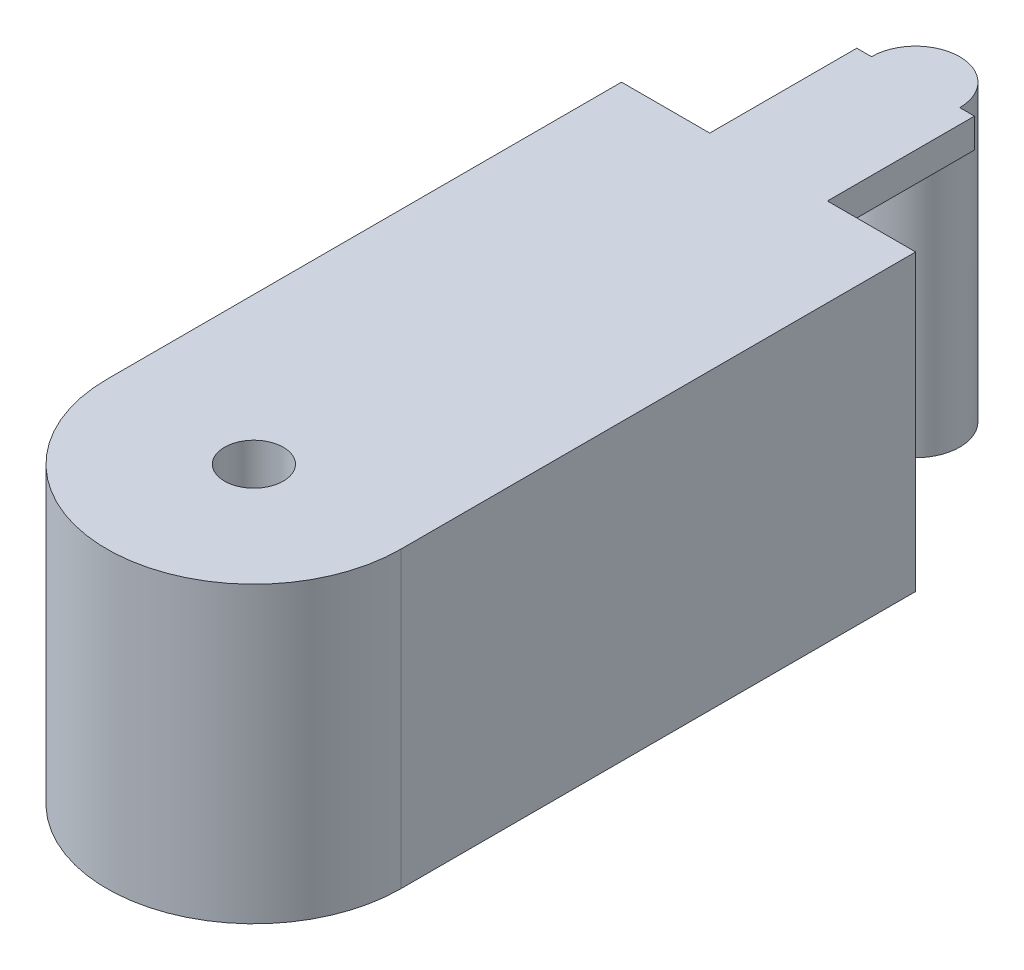
ISO-10303-21;
HEADER;
FILE_DESCRIPTION(('STEP AP214'),'2;1');
FILE_NAME('part.step','',(''),(''),'','','');
FILE_SCHEMA(('AUTOMOTIVE_DESIGN { 1 0 10303 214 1 1 1 1 }'));
ENDSEC;
DATA;
#1=APPLICATION_CONTEXT('core data for automotive mechanical design processes');
#2=APPLICATION_PROTOCOL_DEFINITION('international standard','automotive_design',2000,#1);
#3=PRODUCT_CONTEXT('',#1,'mechanical');
#4=PRODUCT('Part','Part','',(#3));
#5=PRODUCT_RELATED_PRODUCT_CATEGORY('part','',(#4));
#6=PRODUCT_DEFINITION_FORMATION('','',#4);
#7=PRODUCT_DEFINITION_CONTEXT('part definition',#1,'design');
#8=PRODUCT_DEFINITION('design','',#6,#7);
#9=PRODUCT_DEFINITION_SHAPE('','',#8);
#10=(LENGTH_UNIT() NAMED_UNIT(*) SI_UNIT(.MILLI.,.METRE.));
#11=(NAMED_UNIT(*) PLANE_ANGLE_UNIT() SI_UNIT($,.RADIAN.));
#12=(NAMED_UNIT(*) SI_UNIT($,.STERADIAN.) SOLID_ANGLE_UNIT());
#13=UNCERTAINTY_MEASURE_WITH_UNIT(LENGTH_MEASURE(1.E-05),#10,'distance_accuracy_value','');
#14=(GEOMETRIC_REPRESENTATION_CONTEXT(3) GLOBAL_UNCERTAINTY_ASSIGNED_CONTEXT((#13)) GLOBAL_UNIT_ASSIGNED_CONTEXT((#10,
#11,#12)) REPRESENTATION_CONTEXT('',''));
#15=CARTESIAN_POINT('',(0.,0.,0.));
#16=DIRECTION('',(0.,0.,1.));
#17=DIRECTION('',(1.,0.,0.));
#18=AXIS2_PLACEMENT_3D('',#15,#16,#17);
#19=CARTESIAN_POINT('',(0.,100.,0.));
#20=DIRECTION('',(0.,1.,0.));
#21=DIRECTION('',(0.,0.,1.));
#22=AXIS2_PLACEMENT_3D('',#19,#20,#21);
#23=PLANE('',#22);
#24=CARTESIAN_POINT('',(0.,100.,0.));
#25=DIRECTION('',(0.,1.,0.));
#26=DIRECTION('',(0.,0.,1.));
#27=AXIS2_PLACEMENT_3D('',#24,#25,#26);
#28=CIRCLE('',#27,50.);
#29=CARTESIAN_POINT('',(-50.,100.,0.));
#30=VERTEX_POINT('',#29);
#31=CARTESIAN_POINT('',(50.,100.,0.));
#32=VERTEX_POINT('',#31);
#33=EDGE_CURVE('E11',#30,#32,#28,.T.);
#34=ORIENTED_EDGE('',*,*,#33,.T.);
#35=DIRECTION('',(0.,0.,-1.));
#36=VECTOR('',#35,1.);
#37=CARTESIAN_POINT('',(50.,100.,0.));
#38=LINE('',#37,#36);
#39=CARTESIAN_POINT('',(50.,100.,-175.));
#40=VERTEX_POINT('',#39);
#41=EDGE_CURVE('E207',#32,#40,#38,.T.);
#42=ORIENTED_EDGE('',*,*,#41,.T.);
#43=DIRECTION('',(-1.,0.,0.));
#44=VECTOR('',#43,1.);
#45=CARTESIAN_POINT('',(0.,100.,-175.));
#46=LINE('',#45,#44);
#47=CARTESIAN_POINT('',(20.,100.,-175.));
#48=VERTEX_POINT('',#47);
#49=EDGE_CURVE('E196',#40,#48,#46,.T.);
#50=ORIENTED_EDGE('',*,*,#49,.T.);
#51=DIRECTION('',(0.,0.,-1.));
#52=VECTOR('',#51,1.);
#53=CARTESIAN_POINT('',(20.,100.,0.));
#54=LINE('',#53,#52);
#55=CARTESIAN_POINT('',(20.,100.,-225.));
#56=VERTEX_POINT('',#55);
#57=EDGE_CURVE('E63',#48,#56,#54,.T.);
#58=ORIENTED_EDGE('',*,*,#57,.T.);
#59=DIRECTION('',(-1.,0.,0.));
#60=VECTOR('',#59,1.);
#61=CARTESIAN_POINT('',(0.,100.,-225.));
#62=LINE('',#61,#60);
#63=CARTESIAN_POINT('',(15.,100.,-225.));
#64=VERTEX_POINT('',#63);
#65=EDGE_CURVE('E142',#56,#64,#62,.T.);
#66=ORIENTED_EDGE('',*,*,#65,.T.);
#67=CARTESIAN_POINT('',(0.,100.,-225.));
#68=DIRECTION('',(0.,1.,0.));
#69=DIRECTION('',(0.,0.,1.));
#70=AXIS2_PLACEMENT_3D('',#67,#68,#69);
#71=CIRCLE('',#70,15.);
#72=CARTESIAN_POINT('',(-15.,100.,-225.));
#73=VERTEX_POINT('',#72);
#74=EDGE_CURVE('E124',#64,#73,#71,.T.);
#75=ORIENTED_EDGE('',*,*,#74,.T.);
#76=CARTESIAN_POINT('',(-20.,100.,-225.));
#77=VERTEX_POINT('',#76);
#78=EDGE_CURVE('E153',#73,#77,#62,.T.);
#79=ORIENTED_EDGE('',*,*,#78,.T.);
#80=DIRECTION('',(0.,0.,-1.));
#81=VECTOR('',#80,1.);
#82=CARTESIAN_POINT('',(-20.,100.,0.));
#83=LINE('',#82,#81);
#84=CARTESIAN_POINT('',(-20.,100.,-175.));
#85=VERTEX_POINT('',#84);
#86=EDGE_CURVE('E158',#85,#77,#83,.T.);
#87=ORIENTED_EDGE('',*,*,#86,.F.);
#88=CARTESIAN_POINT('',(-50.,100.,-175.));
#89=VERTEX_POINT('',#88);
#90=EDGE_CURVE('E211',#85,#89,#46,.T.);
#91=ORIENTED_EDGE('',*,*,#90,.T.);
#92=DIRECTION('',(0.,0.,-1.));
#93=VECTOR('',#92,1.);
#94=CARTESIAN_POINT('',(-50.,100.,0.));
#95=LINE('',#94,#93);
#96=EDGE_CURVE('E70',#30,#89,#95,.T.);
#97=ORIENTED_EDGE('',*,*,#96,.F.);
#98=EDGE_LOOP('',(#34,#42,#50,#58,#66,#75,#79,#87,#91,#97));
#99=FACE_BOUND('',#98,.T.);
#100=CARTESIAN_POINT('',(0.,100.,0.));
#101=DIRECTION('',(0.,1.,0.));
#102=DIRECTION('',(0.,0.,1.));
#103=AXIS2_PLACEMENT_3D('',#100,#101,#102);
#104=CIRCLE('',#103,10.);
#105=CARTESIAN_POINT('',(0.,100.,10.));
#106=VERTEX_POINT('',#105);
#107=EDGE_CURVE('E228',#106,#106,#104,.T.);
#108=ORIENTED_EDGE('',*,*,#107,.F.);
#109=EDGE_LOOP('',(#108));
#110=FACE_BOUND('',#109,.T.);
#111=ADVANCED_FACE('F47',(#99,#110),#23,.T.);
#112=CARTESIAN_POINT('',(0.,0.,0.));
#113=DIRECTION('',(0.,1.,0.));
#114=DIRECTION('',(0.,0.,1.));
#115=AXIS2_PLACEMENT_3D('',#112,#113,#114);
#116=PLANE('',#115);
#117=CARTESIAN_POINT('',(0.,0.,0.));
#118=DIRECTION('',(0.,1.,0.));
#119=DIRECTION('',(0.,0.,1.));
#120=AXIS2_PLACEMENT_3D('',#117,#118,#119);
#121=CIRCLE('',#120,50.);
#122=CARTESIAN_POINT('',(-50.,0.,0.));
#123=VERTEX_POINT('',#122);
#124=CARTESIAN_POINT('',(50.,0.,0.));
#125=VERTEX_POINT('',#124);
#126=EDGE_CURVE('E51',#123,#125,#121,.T.);
#127=ORIENTED_EDGE('',*,*,#126,.F.);
#128=DIRECTION('',(0.,0.,-1.));
#129=VECTOR('',#128,1.);
#130=CARTESIAN_POINT('',(-50.,0.,0.));
#131=LINE('',#130,#129);
#132=CARTESIAN_POINT('',(-50.,0.,-175.));
#133=VERTEX_POINT('',#132);
#134=EDGE_CURVE('E192',#123,#133,#131,.T.);
#135=ORIENTED_EDGE('',*,*,#134,.T.);
#136=DIRECTION('',(-1.,0.,0.));
#137=VECTOR('',#136,1.);
#138=CARTESIAN_POINT('',(0.,0.,-175.));
#139=LINE('',#138,#137);
#140=CARTESIAN_POINT('',(50.,0.,-175.));
#141=VERTEX_POINT('',#140);
#142=EDGE_CURVE('E200',#141,#133,#139,.T.);
#143=ORIENTED_EDGE('',*,*,#142,.F.);
#144=DIRECTION('',(0.,0.,-1.));
#145=VECTOR('',#144,1.);
#146=CARTESIAN_POINT('',(50.,0.,0.));
#147=LINE('',#146,#145);
#148=EDGE_CURVE('E195',#125,#141,#147,.T.);
#149=ORIENTED_EDGE('',*,*,#148,.F.);
#150=EDGE_LOOP('',(#127,#135,#143,#149));
#151=FACE_BOUND('',#150,.T.);
#152=CARTESIAN_POINT('',(0.,0.,0.));
#153=DIRECTION('',(0.,1.,0.));
#154=DIRECTION('',(0.,0.,1.));
#155=AXIS2_PLACEMENT_3D('',#152,#153,#154);
#156=CIRCLE('',#155,10.);
#157=CARTESIAN_POINT('',(0.,0.,10.));
#158=VERTEX_POINT('',#157);
#159=EDGE_CURVE('E218',#158,#158,#156,.T.);
#160=ORIENTED_EDGE('',*,*,#159,.T.);
#161=EDGE_LOOP('',(#160));
#162=FACE_BOUND('',#161,.T.);
#163=ADVANCED_FACE('F236',(#151,#162),#116,.F.);
#164=CARTESIAN_POINT('',(0.,100.,0.));
#165=DIRECTION('',(0.,-1.,0.));
#166=DIRECTION('',(0.,0.,-1.));
#167=AXIS2_PLACEMENT_3D('',#164,#165,#166);
#168=CYLINDRICAL_SURFACE('',#167,50.);
#169=ORIENTED_EDGE('',*,*,#33,.F.);
#170=DIRECTION('',(0.,1.,0.));
#171=VECTOR('',#170,1.);
#172=CARTESIAN_POINT('',(-50.,0.,0.));
#173=LINE('',#172,#171);
#174=EDGE_CURVE('E204',#123,#30,#173,.T.);
#175=ORIENTED_EDGE('',*,*,#174,.F.);
#176=ORIENTED_EDGE('',*,*,#126,.T.);
#177=DIRECTION('',(0.,1.,0.));
#178=VECTOR('',#177,1.);
#179=CARTESIAN_POINT('',(50.,0.,0.));
#180=LINE('',#179,#178);
#181=EDGE_CURVE('E222',#125,#32,#180,.T.);
#182=ORIENTED_EDGE('',*,*,#181,.T.);
#183=EDGE_LOOP('',(#169,#175,#176,#182));
#184=FACE_BOUND('',#183,.T.);
#185=ADVANCED_FACE('F49',(#184),#168,.T.);
#186=CARTESIAN_POINT('',(0.,100.,0.));
#187=DIRECTION('',(0.,-1.,0.));
#188=DIRECTION('',(0.,0.,-1.));
#189=AXIS2_PLACEMENT_3D('',#186,#187,#188);
#190=CYLINDRICAL_SURFACE('',#189,10.);
#191=ORIENTED_EDGE('',*,*,#107,.T.);
#192=EDGE_LOOP('',(#191));
#193=FACE_BOUND('',#192,.T.);
#194=ORIENTED_EDGE('',*,*,#159,.F.);
#195=EDGE_LOOP('',(#194));
#196=FACE_BOUND('',#195,.T.);
#197=ADVANCED_FACE('F238',(#193,#196),#190,.F.);
#198=CARTESIAN_POINT('',(-50.,0.,0.));
#199=DIRECTION('',(1.,0.,0.));
#200=DIRECTION('',(0.,0.,-1.));
#201=AXIS2_PLACEMENT_3D('',#198,#199,#200);
#202=PLANE('',#201);
#203=ORIENTED_EDGE('',*,*,#96,.T.);
#204=DIRECTION('',(0.,1.,0.));
#205=VECTOR('',#204,1.);
#206=CARTESIAN_POINT('',(-50.,0.,-175.));
#207=LINE('',#206,#205);
#208=EDGE_CURVE('E214',#133,#89,#207,.T.);
#209=ORIENTED_EDGE('',*,*,#208,.F.);
#210=ORIENTED_EDGE('',*,*,#134,.F.);
#211=ORIENTED_EDGE('',*,*,#174,.T.);
#212=EDGE_LOOP('',(#203,#209,#210,#211));
#213=FACE_BOUND('',#212,.T.);
#214=ADVANCED_FACE('F240',(#213),#202,.F.);
#215=CARTESIAN_POINT('',(0.,0.,-175.));
#216=DIRECTION('',(0.,0.,-1.));
#217=DIRECTION('',(-1.,0.,0.));
#218=AXIS2_PLACEMENT_3D('',#215,#216,#217);
#219=PLANE('',#218);
#220=DIRECTION('',(0.,1.,0.));
#221=VECTOR('',#220,1.);
#222=CARTESIAN_POINT('',(-20.,90.,-175.));
#223=LINE('',#222,#221);
#224=CARTESIAN_POINT('',(-20.,90.,-175.));
#225=VERTEX_POINT('',#224);
#226=EDGE_CURVE('E188',#225,#85,#223,.T.);
#227=ORIENTED_EDGE('',*,*,#226,.F.);
#228=DIRECTION('',(-1.,0.,0.));
#229=VECTOR('',#228,1.);
#230=CARTESIAN_POINT('',(0.,90.,-175.));
#231=LINE('',#230,#229);
#232=CARTESIAN_POINT('',(20.,90.,-175.));
#233=VERTEX_POINT('',#232);
#234=EDGE_CURVE('E177',#233,#225,#231,.T.);
#235=ORIENTED_EDGE('',*,*,#234,.F.);
#236=DIRECTION('',(0.,1.,0.));
#237=VECTOR('',#236,1.);
#238=CARTESIAN_POINT('',(20.,90.,-175.));
#239=LINE('',#238,#237);
#240=EDGE_CURVE('E402',#233,#48,#239,.T.);
#241=ORIENTED_EDGE('',*,*,#240,.T.);
#242=ORIENTED_EDGE('',*,*,#49,.F.);
#243=DIRECTION('',(0.,1.,0.));
#244=VECTOR('',#243,1.);
#245=CARTESIAN_POINT('',(50.,0.,-175.));
#246=LINE('',#245,#244);
#247=EDGE_CURVE('E219',#141,#40,#246,.T.);
#248=ORIENTED_EDGE('',*,*,#247,.F.);
#249=ORIENTED_EDGE('',*,*,#142,.T.);
#250=ORIENTED_EDGE('',*,*,#208,.T.);
#251=ORIENTED_EDGE('',*,*,#90,.F.);
#252=EDGE_LOOP('',(#227,#235,#241,#242,#248,#249,#250,#251));
#253=FACE_BOUND('',#252,.T.);
#254=ADVANCED_FACE('F247',(#253),#219,.T.);
#255=CARTESIAN_POINT('',(50.,0.,0.));
#256=DIRECTION('',(1.,0.,0.));
#257=DIRECTION('',(0.,0.,-1.));
#258=AXIS2_PLACEMENT_3D('',#255,#256,#257);
#259=PLANE('',#258);
#260=ORIENTED_EDGE('',*,*,#41,.F.);
#261=ORIENTED_EDGE('',*,*,#181,.F.);
#262=ORIENTED_EDGE('',*,*,#148,.T.);
#263=ORIENTED_EDGE('',*,*,#247,.T.);
#264=EDGE_LOOP('',(#260,#261,#262,#263));
#265=FACE_BOUND('',#264,.T.);
#266=ADVANCED_FACE('F274',(#265),#259,.T.);
#267=CARTESIAN_POINT('',(0.,90.,-225.));
#268=DIRECTION('',(0.,0.,-1.));
#269=DIRECTION('',(-1.,0.,0.));
#270=AXIS2_PLACEMENT_3D('',#267,#268,#269);
#271=PLANE('',#270);
#272=ORIENTED_EDGE('',*,*,#65,.F.);
#273=DIRECTION('',(0.,1.,0.));
#274=VECTOR('',#273,1.);
#275=CARTESIAN_POINT('',(20.,90.,-225.));
#276=LINE('',#275,#274);
#277=CARTESIAN_POINT('',(20.,90.,-225.));
#278=VERTEX_POINT('',#277);
#279=EDGE_CURVE('E146',#278,#56,#276,.T.);
#280=ORIENTED_EDGE('',*,*,#279,.F.);
#281=DIRECTION('',(-1.,0.,0.));
#282=VECTOR('',#281,1.);
#283=CARTESIAN_POINT('',(0.,90.,-225.));
#284=LINE('',#283,#282);
#285=CARTESIAN_POINT('',(15.,90.,-225.));
#286=VERTEX_POINT('',#285);
#287=EDGE_CURVE('E144',#278,#286,#284,.T.);
#288=ORIENTED_EDGE('',*,*,#287,.T.);
#289=DIRECTION('',(0.,1.,0.));
#290=VECTOR('',#289,1.);
#291=CARTESIAN_POINT('',(15.,90.,-225.));
#292=LINE('',#291,#290);
#293=EDGE_CURVE('E128',#286,#64,#292,.T.);
#294=ORIENTED_EDGE('',*,*,#293,.T.);
#295=EDGE_LOOP('',(#272,#280,#288,#294));
#296=FACE_BOUND('',#295,.T.);
#297=ADVANCED_FACE('F141',(#296),#271,.T.);
#298=CARTESIAN_POINT('',(20.,90.,0.));
#299=DIRECTION('',(1.,0.,0.));
#300=DIRECTION('',(0.,0.,-1.));
#301=AXIS2_PLACEMENT_3D('',#298,#299,#300);
#302=PLANE('',#301);
#303=ORIENTED_EDGE('',*,*,#57,.F.);
#304=ORIENTED_EDGE('',*,*,#240,.F.);
#305=DIRECTION('',(0.,0.,-1.));
#306=VECTOR('',#305,1.);
#307=CARTESIAN_POINT('',(20.,90.,0.));
#308=LINE('',#307,#306);
#309=EDGE_CURVE('E179',#233,#278,#308,.T.);
#310=ORIENTED_EDGE('',*,*,#309,.T.);
#311=ORIENTED_EDGE('',*,*,#279,.T.);
#312=EDGE_LOOP('',(#303,#304,#310,#311));
#313=FACE_BOUND('',#312,.T.);
#314=ADVANCED_FACE('F280',(#313),#302,.T.);
#315=CARTESIAN_POINT('',(-20.,90.,0.));
#316=DIRECTION('',(1.,0.,0.));
#317=DIRECTION('',(0.,0.,-1.));
#318=AXIS2_PLACEMENT_3D('',#315,#316,#317);
#319=PLANE('',#318);
#320=ORIENTED_EDGE('',*,*,#86,.T.);
#321=DIRECTION('',(0.,1.,0.));
#322=VECTOR('',#321,1.);
#323=CARTESIAN_POINT('',(-20.,90.,-225.));
#324=LINE('',#323,#322);
#325=CARTESIAN_POINT('',(-20.,90.,-225.));
#326=VERTEX_POINT('',#325);
#327=EDGE_CURVE('E185',#326,#77,#324,.T.);
#328=ORIENTED_EDGE('',*,*,#327,.F.);
#329=DIRECTION('',(0.,0.,-1.));
#330=VECTOR('',#329,1.);
#331=CARTESIAN_POINT('',(-20.,90.,0.));
#332=LINE('',#331,#330);
#333=EDGE_CURVE('E174',#225,#326,#332,.T.);
#334=ORIENTED_EDGE('',*,*,#333,.F.);
#335=ORIENTED_EDGE('',*,*,#226,.T.);
#336=EDGE_LOOP('',(#320,#328,#334,#335));
#337=FACE_BOUND('',#336,.T.);
#338=ADVANCED_FACE('F285',(#337),#319,.F.);
#339=ORIENTED_EDGE('',*,*,#78,.F.);
#340=DIRECTION('',(0.,1.,0.));
#341=VECTOR('',#340,1.);
#342=CARTESIAN_POINT('',(-15.,90.,-225.));
#343=LINE('',#342,#341);
#344=CARTESIAN_POINT('',(-15.,90.,-225.));
#345=VERTEX_POINT('',#344);
#346=EDGE_CURVE('E131',#345,#73,#343,.T.);
#347=ORIENTED_EDGE('',*,*,#346,.F.);
#348=EDGE_CURVE('E156',#345,#326,#284,.T.);
#349=ORIENTED_EDGE('',*,*,#348,.T.);
#350=ORIENTED_EDGE('',*,*,#327,.T.);
#351=EDGE_LOOP('',(#339,#347,#349,#350));
#352=FACE_BOUND('',#351,.T.);
#353=ADVANCED_FACE('F282',(#352),#271,.T.);
#354=CARTESIAN_POINT('',(0.,90.,0.));
#355=DIRECTION('',(0.,1.,0.));
#356=DIRECTION('',(0.,0.,1.));
#357=AXIS2_PLACEMENT_3D('',#354,#355,#356);
#358=PLANE('',#357);
#359=CARTESIAN_POINT('',(0.,90.,-225.));
#360=DIRECTION('',(0.,1.,0.));
#361=DIRECTION('',(0.,0.,1.));
#362=AXIS2_PLACEMENT_3D('',#359,#360,#361);
#363=CIRCLE('',#362,15.);
#364=EDGE_CURVE('E151',#345,#286,#363,.T.);
#365=ORIENTED_EDGE('',*,*,#364,.T.);
#366=ORIENTED_EDGE('',*,*,#287,.F.);
#367=ORIENTED_EDGE('',*,*,#309,.F.);
#368=ORIENTED_EDGE('',*,*,#234,.T.);
#369=ORIENTED_EDGE('',*,*,#333,.T.);
#370=ORIENTED_EDGE('',*,*,#348,.F.);
#371=EDGE_LOOP('',(#365,#366,#367,#368,#369,#370));
#372=FACE_BOUND('',#371,.T.);
#373=ADVANCED_FACE('F290',(#372),#358,.F.);
#374=CARTESIAN_POINT('',(0.,0.,-225.));
#375=DIRECTION('',(0.,1.,0.));
#376=DIRECTION('',(0.,0.,1.));
#377=AXIS2_PLACEMENT_3D('',#374,#375,#376);
#378=CYLINDRICAL_SURFACE('',#377,15.);
#379=ORIENTED_EDGE('',*,*,#74,.F.);
#380=ORIENTED_EDGE('',*,*,#293,.F.);
#381=ORIENTED_EDGE('',*,*,#364,.F.);
#382=ORIENTED_EDGE('',*,*,#346,.T.);
#383=EDGE_LOOP('',(#379,#380,#381,#382));
#384=FACE_BOUND('',#383,.T.);
#385=CARTESIAN_POINT('',(0.,0.,-225.));
#386=DIRECTION('',(0.,1.,0.));
#387=DIRECTION('',(0.,0.,1.));
#388=AXIS2_PLACEMENT_3D('',#385,#386,#387);
#389=CIRCLE('',#388,15.);
#390=CARTESIAN_POINT('',(0.,0.,-210.));
#391=VERTEX_POINT('',#390);
#392=EDGE_CURVE('E136',#391,#391,#389,.T.);
#393=ORIENTED_EDGE('',*,*,#392,.T.);
#394=EDGE_LOOP('',(#393));
#395=FACE_BOUND('',#394,.T.);
#396=ADVANCED_FACE('F126',(#384,#395),#378,.T.);
#397=CARTESIAN_POINT('',(0.,0.,0.));
#398=DIRECTION('',(0.,1.,0.));
#399=DIRECTION('',(0.,0.,1.));
#400=AXIS2_PLACEMENT_3D('',#397,#398,#399);
#401=PLANE('',#400);
#402=ORIENTED_EDGE('',*,*,#392,.F.);
#403=EDGE_LOOP('',(#402));
#404=FACE_BOUND('',#403,.T.);
#405=ADVANCED_FACE('F296',(#404),#401,.F.);
#406=CLOSED_SHELL('',(#111,#163,#185,#197,#214,#254,#266,#297,#314,#338,#353,#373,#396,#405));
#407=MANIFOLD_SOLID_BREP('B2',#406);
#408=ADVANCED_BREP_SHAPE_REPRESENTATION('',(#18,#407),#14);
#409=SHAPE_DEFINITION_REPRESENTATION(#9,#408);
ENDSEC;
END-ISO-10303-21;
